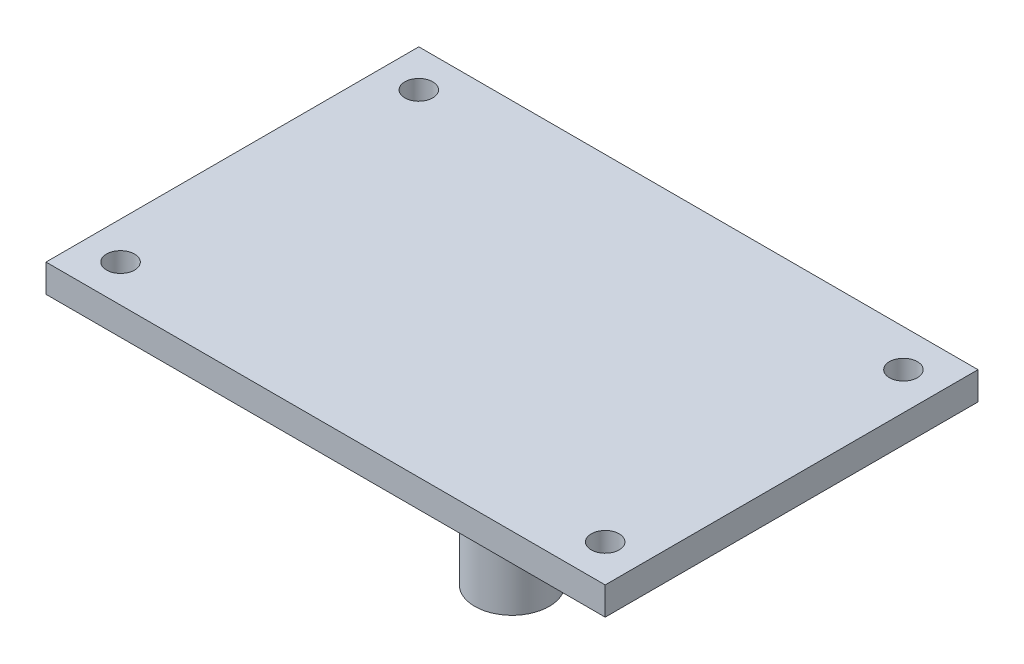
ISO-10303-21;
HEADER;
FILE_DESCRIPTION(('STEP AP214'),'2;1');
FILE_NAME('part.step','',(''),(''),'','','');
FILE_SCHEMA(('AUTOMOTIVE_DESIGN { 1 0 10303 214 1 1 1 1 }'));
ENDSEC;
DATA;
#1=APPLICATION_CONTEXT('core data for automotive mechanical design processes');
#2=APPLICATION_PROTOCOL_DEFINITION('international standard','automotive_design',2000,#1);
#3=PRODUCT_CONTEXT('',#1,'mechanical');
#4=PRODUCT('Part','Part','',(#3));
#5=PRODUCT_RELATED_PRODUCT_CATEGORY('part','',(#4));
#6=PRODUCT_DEFINITION_FORMATION('','',#4);
#7=PRODUCT_DEFINITION_CONTEXT('part definition',#1,'design');
#8=PRODUCT_DEFINITION('design','',#6,#7);
#9=PRODUCT_DEFINITION_SHAPE('','',#8);
#10=(LENGTH_UNIT() NAMED_UNIT(*) SI_UNIT(.MILLI.,.METRE.));
#11=(NAMED_UNIT(*) PLANE_ANGLE_UNIT() SI_UNIT($,.RADIAN.));
#12=(NAMED_UNIT(*) SI_UNIT($,.STERADIAN.) SOLID_ANGLE_UNIT());
#13=UNCERTAINTY_MEASURE_WITH_UNIT(LENGTH_MEASURE(1.E-05),#10,'distance_accuracy_value','');
#14=(GEOMETRIC_REPRESENTATION_CONTEXT(3) GLOBAL_UNCERTAINTY_ASSIGNED_CONTEXT((#13)) GLOBAL_UNIT_ASSIGNED_CONTEXT((#10,
#11,#12)) REPRESENTATION_CONTEXT('',''));
#15=CARTESIAN_POINT('',(0.,0.,0.));
#16=DIRECTION('',(0.,0.,1.));
#17=DIRECTION('',(1.,0.,0.));
#18=AXIS2_PLACEMENT_3D('',#15,#16,#17);
#19=CARTESIAN_POINT('',(0.,18.,0.));
#20=DIRECTION('',(0.,-1.,0.));
#21=DIRECTION('',(0.,0.,-1.));
#22=AXIS2_PLACEMENT_3D('',#19,#20,#21);
#23=CYLINDRICAL_SURFACE('',#22,4.);
#24=CARTESIAN_POINT('',(0.,18.,0.));
#25=DIRECTION('',(0.,1.,0.));
#26=DIRECTION('',(0.,0.,1.));
#27=AXIS2_PLACEMENT_3D('',#24,#25,#26);
#28=CIRCLE('',#27,4.);
#29=CARTESIAN_POINT('',(0.,18.,4.));
#30=VERTEX_POINT('',#29);
#31=EDGE_CURVE('E11',#30,#30,#28,.T.);
#32=ORIENTED_EDGE('',*,*,#31,.F.);
#33=EDGE_LOOP('',(#32));
#34=FACE_BOUND('',#33,.T.);
#35=CARTESIAN_POINT('',(0.,0.,0.));
#36=DIRECTION('',(0.,1.,0.));
#37=DIRECTION('',(0.,0.,1.));
#38=AXIS2_PLACEMENT_3D('',#35,#36,#37);
#39=CIRCLE('',#38,4.);
#40=CARTESIAN_POINT('',(0.,0.,4.));
#41=VERTEX_POINT('',#40);
#42=EDGE_CURVE('E41',#41,#41,#39,.T.);
#43=ORIENTED_EDGE('',*,*,#42,.T.);
#44=EDGE_LOOP('',(#43));
#45=FACE_BOUND('',#44,.T.);
#46=ADVANCED_FACE('F38',(#34,#45),#23,.T.);
#47=CARTESIAN_POINT('',(0.,0.,0.));
#48=DIRECTION('',(0.,1.,0.));
#49=DIRECTION('',(0.,0.,1.));
#50=AXIS2_PLACEMENT_3D('',#47,#48,#49);
#51=PLANE('',#50);
#52=ORIENTED_EDGE('',*,*,#42,.F.);
#53=EDGE_LOOP('',(#52));
#54=FACE_BOUND('',#53,.T.);
#55=ADVANCED_FACE('F150',(#54),#51,.F.);
#56=CARTESIAN_POINT('',(0.,22.,0.));
#57=DIRECTION('',(0.,-1.,0.));
#58=DIRECTION('',(0.,0.,-1.));
#59=AXIS2_PLACEMENT_3D('',#56,#57,#58);
#60=CYLINDRICAL_SURFACE('',#59,5.);
#61=CARTESIAN_POINT('',(0.,22.,0.));
#62=DIRECTION('',(0.,1.,0.));
#63=DIRECTION('',(0.,0.,1.));
#64=AXIS2_PLACEMENT_3D('',#61,#62,#63);
#65=CIRCLE('',#64,5.);
#66=CARTESIAN_POINT('',(0.,22.,5.));
#67=VERTEX_POINT('',#66);
#68=EDGE_CURVE('E129',#67,#67,#65,.T.);
#69=ORIENTED_EDGE('',*,*,#68,.F.);
#70=EDGE_LOOP('',(#69));
#71=FACE_BOUND('',#70,.T.);
#72=CARTESIAN_POINT('',(0.,18.,0.));
#73=DIRECTION('',(0.,1.,0.));
#74=DIRECTION('',(0.,0.,1.));
#75=AXIS2_PLACEMENT_3D('',#72,#73,#74);
#76=CIRCLE('',#75,5.);
#77=CARTESIAN_POINT('',(0.,18.,5.));
#78=VERTEX_POINT('',#77);
#79=EDGE_CURVE('E128',#78,#78,#76,.T.);
#80=ORIENTED_EDGE('',*,*,#79,.T.);
#81=EDGE_LOOP('',(#80));
#82=FACE_BOUND('',#81,.T.);
#83=ADVANCED_FACE('F137',(#71,#82),#60,.T.);
#84=CARTESIAN_POINT('',(0.,18.,0.));
#85=DIRECTION('',(0.,1.,0.));
#86=DIRECTION('',(0.,0.,1.));
#87=AXIS2_PLACEMENT_3D('',#84,#85,#86);
#88=PLANE('',#87);
#89=ORIENTED_EDGE('',*,*,#31,.T.);
#90=EDGE_LOOP('',(#89));
#91=FACE_BOUND('',#90,.T.);
#92=ORIENTED_EDGE('',*,*,#79,.F.);
#93=EDGE_LOOP('',(#92));
#94=FACE_BOUND('',#93,.T.);
#95=ADVANCED_FACE('F139',(#91,#94),#88,.F.);
#96=CARTESIAN_POINT('',(0.,25.,0.));
#97=DIRECTION('',(0.,1.,0.));
#98=DIRECTION('',(0.,0.,1.));
#99=AXIS2_PLACEMENT_3D('',#96,#97,#98);
#100=PLANE('',#99);
#101=CARTESIAN_POINT('',(26.,25.,16.));
#102=DIRECTION('',(0.,1.,0.));
#103=DIRECTION('',(0.,0.,1.));
#104=AXIS2_PLACEMENT_3D('',#101,#102,#103);
#105=CIRCLE('',#104,1.5);
#106=CARTESIAN_POINT('',(26.,25.,17.5));
#107=VERTEX_POINT('',#106);
#108=EDGE_CURVE('E282',#107,#107,#105,.T.);
#109=ORIENTED_EDGE('',*,*,#108,.F.);
#110=EDGE_LOOP('',(#109));
#111=FACE_BOUND('',#110,.T.);
#112=CARTESIAN_POINT('',(-26.,25.,-16.));
#113=DIRECTION('',(0.,1.,0.));
#114=DIRECTION('',(0.,0.,1.));
#115=AXIS2_PLACEMENT_3D('',#112,#113,#114);
#116=CIRCLE('',#115,1.5);
#117=CARTESIAN_POINT('',(-26.,25.,-14.5));
#118=VERTEX_POINT('',#117);
#119=EDGE_CURVE('E115',#118,#118,#116,.T.);
#120=ORIENTED_EDGE('',*,*,#119,.F.);
#121=EDGE_LOOP('',(#120));
#122=FACE_BOUND('',#121,.T.);
#123=DIRECTION('',(0.,0.,-1.));
#124=VECTOR('',#123,1.);
#125=CARTESIAN_POINT('',(30.,25.,-20.));
#126=LINE('',#125,#124);
#127=CARTESIAN_POINT('',(30.,25.,20.));
#128=VERTEX_POINT('',#127);
#129=CARTESIAN_POINT('',(30.,25.,-20.));
#130=VERTEX_POINT('',#129);
#131=EDGE_CURVE('E92',#128,#130,#126,.T.);
#132=ORIENTED_EDGE('',*,*,#131,.T.);
#133=DIRECTION('',(-1.,0.,0.));
#134=VECTOR('',#133,1.);
#135=CARTESIAN_POINT('',(-30.,25.,-20.));
#136=LINE('',#135,#134);
#137=CARTESIAN_POINT('',(-30.,25.,-20.));
#138=VERTEX_POINT('',#137);
#139=EDGE_CURVE('E86',#130,#138,#136,.T.);
#140=ORIENTED_EDGE('',*,*,#139,.T.);
#141=DIRECTION('',(0.,0.,1.));
#142=VECTOR('',#141,1.);
#143=CARTESIAN_POINT('',(-30.,25.,-20.));
#144=LINE('',#143,#142);
#145=CARTESIAN_POINT('',(-30.,25.,20.));
#146=VERTEX_POINT('',#145);
#147=EDGE_CURVE('E90',#138,#146,#144,.T.);
#148=ORIENTED_EDGE('',*,*,#147,.T.);
#149=DIRECTION('',(1.,0.,0.));
#150=VECTOR('',#149,1.);
#151=CARTESIAN_POINT('',(-30.,25.,20.));
#152=LINE('',#151,#150);
#153=EDGE_CURVE('E55',#146,#128,#152,.T.);
#154=ORIENTED_EDGE('',*,*,#153,.T.);
#155=EDGE_LOOP('',(#132,#140,#148,#154));
#156=FACE_BOUND('',#155,.T.);
#157=CARTESIAN_POINT('',(26.,25.,-16.));
#158=DIRECTION('',(0.,1.,0.));
#159=DIRECTION('',(0.,0.,-1.));
#160=AXIS2_PLACEMENT_3D('',#157,#158,#159);
#161=CIRCLE('',#160,1.5);
#162=CARTESIAN_POINT('',(26.,25.,-17.5));
#163=VERTEX_POINT('',#162);
#164=EDGE_CURVE('E290',#163,#163,#161,.T.);
#165=ORIENTED_EDGE('',*,*,#164,.F.);
#166=EDGE_LOOP('',(#165));
#167=FACE_BOUND('',#166,.T.);
#168=CARTESIAN_POINT('',(-26.,25.,16.));
#169=DIRECTION('',(0.,1.,0.));
#170=DIRECTION('',(0.,0.,-1.));
#171=AXIS2_PLACEMENT_3D('',#168,#169,#170);
#172=CIRCLE('',#171,1.5);
#173=CARTESIAN_POINT('',(-26.,25.,14.5));
#174=VERTEX_POINT('',#173);
#175=EDGE_CURVE('E271',#174,#174,#172,.T.);
#176=ORIENTED_EDGE('',*,*,#175,.F.);
#177=EDGE_LOOP('',(#176));
#178=FACE_BOUND('',#177,.T.);
#179=ADVANCED_FACE('F87',(#111,#122,#156,#167,#178),#100,.T.);
#180=CARTESIAN_POINT('',(0.,22.,0.));
#181=DIRECTION('',(0.,1.,0.));
#182=DIRECTION('',(0.,0.,1.));
#183=AXIS2_PLACEMENT_3D('',#180,#181,#182);
#184=PLANE('',#183);
#185=ORIENTED_EDGE('',*,*,#68,.T.);
#186=EDGE_LOOP('',(#185));
#187=FACE_BOUND('',#186,.T.);
#188=DIRECTION('',(0.,0.,-1.));
#189=VECTOR('',#188,1.);
#190=CARTESIAN_POINT('',(30.,22.,-20.));
#191=LINE('',#190,#189);
#192=CARTESIAN_POINT('',(30.,22.,20.));
#193=VERTEX_POINT('',#192);
#194=CARTESIAN_POINT('',(30.,22.,-20.));
#195=VERTEX_POINT('',#194);
#196=EDGE_CURVE('E111',#193,#195,#191,.T.);
#197=ORIENTED_EDGE('',*,*,#196,.F.);
#198=DIRECTION('',(1.,0.,0.));
#199=VECTOR('',#198,1.);
#200=CARTESIAN_POINT('',(-30.,22.,20.));
#201=LINE('',#200,#199);
#202=CARTESIAN_POINT('',(-30.,22.,20.));
#203=VERTEX_POINT('',#202);
#204=EDGE_CURVE('E78',#203,#193,#201,.T.);
#205=ORIENTED_EDGE('',*,*,#204,.F.);
#206=DIRECTION('',(0.,0.,1.));
#207=VECTOR('',#206,1.);
#208=CARTESIAN_POINT('',(-30.,22.,-20.));
#209=LINE('',#208,#207);
#210=CARTESIAN_POINT('',(-30.,22.,-20.));
#211=VERTEX_POINT('',#210);
#212=EDGE_CURVE('E72',#211,#203,#209,.T.);
#213=ORIENTED_EDGE('',*,*,#212,.F.);
#214=DIRECTION('',(-1.,0.,0.));
#215=VECTOR('',#214,1.);
#216=CARTESIAN_POINT('',(-30.,22.,-20.));
#217=LINE('',#216,#215);
#218=EDGE_CURVE('E98',#195,#211,#217,.T.);
#219=ORIENTED_EDGE('',*,*,#218,.F.);
#220=EDGE_LOOP('',(#197,#205,#213,#219));
#221=FACE_BOUND('',#220,.T.);
#222=CARTESIAN_POINT('',(-26.,22.,-16.));
#223=DIRECTION('',(0.,1.,0.));
#224=DIRECTION('',(0.,0.,1.));
#225=AXIS2_PLACEMENT_3D('',#222,#223,#224);
#226=CIRCLE('',#225,1.5);
#227=CARTESIAN_POINT('',(-26.,22.,-14.5));
#228=VERTEX_POINT('',#227);
#229=EDGE_CURVE('E294',#228,#228,#226,.T.);
#230=ORIENTED_EDGE('',*,*,#229,.T.);
#231=EDGE_LOOP('',(#230));
#232=FACE_BOUND('',#231,.T.);
#233=CARTESIAN_POINT('',(26.,22.,-16.));
#234=DIRECTION('',(0.,1.,0.));
#235=DIRECTION('',(0.,0.,-1.));
#236=AXIS2_PLACEMENT_3D('',#233,#234,#235);
#237=CIRCLE('',#236,1.5);
#238=CARTESIAN_POINT('',(26.,22.,-17.5));
#239=VERTEX_POINT('',#238);
#240=EDGE_CURVE('E286',#239,#239,#237,.T.);
#241=ORIENTED_EDGE('',*,*,#240,.T.);
#242=EDGE_LOOP('',(#241));
#243=FACE_BOUND('',#242,.T.);
#244=CARTESIAN_POINT('',(26.,22.,16.));
#245=DIRECTION('',(0.,1.,0.));
#246=DIRECTION('',(0.,0.,1.));
#247=AXIS2_PLACEMENT_3D('',#244,#245,#246);
#248=CIRCLE('',#247,1.5);
#249=CARTESIAN_POINT('',(26.,22.,17.5));
#250=VERTEX_POINT('',#249);
#251=EDGE_CURVE('E279',#250,#250,#248,.T.);
#252=ORIENTED_EDGE('',*,*,#251,.T.);
#253=EDGE_LOOP('',(#252));
#254=FACE_BOUND('',#253,.T.);
#255=CARTESIAN_POINT('',(-26.,22.,16.));
#256=DIRECTION('',(0.,1.,0.));
#257=DIRECTION('',(0.,0.,-1.));
#258=AXIS2_PLACEMENT_3D('',#255,#256,#257);
#259=CIRCLE('',#258,1.5);
#260=CARTESIAN_POINT('',(-26.,22.,14.5));
#261=VERTEX_POINT('',#260);
#262=EDGE_CURVE('E274',#261,#261,#259,.T.);
#263=ORIENTED_EDGE('',*,*,#262,.T.);
#264=EDGE_LOOP('',(#263));
#265=FACE_BOUND('',#264,.T.);
#266=ADVANCED_FACE('F147',(#187,#221,#232,#243,#254,#265),#184,.F.);
#267=CARTESIAN_POINT('',(30.,25.,-20.));
#268=DIRECTION('',(-1.,0.,0.));
#269=DIRECTION('',(0.,0.,1.));
#270=AXIS2_PLACEMENT_3D('',#267,#268,#269);
#271=PLANE('',#270);
#272=ORIENTED_EDGE('',*,*,#196,.T.);
#273=DIRECTION('',(0.,-1.,0.));
#274=VECTOR('',#273,1.);
#275=CARTESIAN_POINT('',(30.,25.,-20.));
#276=LINE('',#275,#274);
#277=EDGE_CURVE('E100',#130,#195,#276,.T.);
#278=ORIENTED_EDGE('',*,*,#277,.F.);
#279=ORIENTED_EDGE('',*,*,#131,.F.);
#280=DIRECTION('',(0.,-1.,0.));
#281=VECTOR('',#280,1.);
#282=CARTESIAN_POINT('',(30.,25.,20.));
#283=LINE('',#282,#281);
#284=EDGE_CURVE('E107',#128,#193,#283,.T.);
#285=ORIENTED_EDGE('',*,*,#284,.T.);
#286=EDGE_LOOP('',(#272,#278,#279,#285));
#287=FACE_BOUND('',#286,.T.);
#288=ADVANCED_FACE('F190',(#287),#271,.F.);
#289=CARTESIAN_POINT('',(-30.,25.,-20.));
#290=DIRECTION('',(0.,0.,1.));
#291=DIRECTION('',(1.,0.,0.));
#292=AXIS2_PLACEMENT_3D('',#289,#290,#291);
#293=PLANE('',#292);
#294=ORIENTED_EDGE('',*,*,#218,.T.);
#295=DIRECTION('',(0.,-1.,0.));
#296=VECTOR('',#295,1.);
#297=CARTESIAN_POINT('',(-30.,25.,-20.));
#298=LINE('',#297,#296);
#299=EDGE_CURVE('E96',#138,#211,#298,.T.);
#300=ORIENTED_EDGE('',*,*,#299,.F.);
#301=ORIENTED_EDGE('',*,*,#139,.F.);
#302=ORIENTED_EDGE('',*,*,#277,.T.);
#303=EDGE_LOOP('',(#294,#300,#301,#302));
#304=FACE_BOUND('',#303,.T.);
#305=ADVANCED_FACE('F97',(#304),#293,.F.);
#306=CARTESIAN_POINT('',(-30.,25.,-20.));
#307=DIRECTION('',(1.,0.,0.));
#308=DIRECTION('',(0.,0.,-1.));
#309=AXIS2_PLACEMENT_3D('',#306,#307,#308);
#310=PLANE('',#309);
#311=ORIENTED_EDGE('',*,*,#212,.T.);
#312=DIRECTION('',(0.,-1.,0.));
#313=VECTOR('',#312,1.);
#314=CARTESIAN_POINT('',(-30.,25.,20.));
#315=LINE('',#314,#313);
#316=EDGE_CURVE('E101',#146,#203,#315,.T.);
#317=ORIENTED_EDGE('',*,*,#316,.F.);
#318=ORIENTED_EDGE('',*,*,#147,.F.);
#319=ORIENTED_EDGE('',*,*,#299,.T.);
#320=EDGE_LOOP('',(#311,#317,#318,#319));
#321=FACE_BOUND('',#320,.T.);
#322=ADVANCED_FACE('F103',(#321),#310,.F.);
#323=CARTESIAN_POINT('',(-30.,25.,20.));
#324=DIRECTION('',(0.,0.,-1.));
#325=DIRECTION('',(-1.,0.,0.));
#326=AXIS2_PLACEMENT_3D('',#323,#324,#325);
#327=PLANE('',#326);
#328=ORIENTED_EDGE('',*,*,#204,.T.);
#329=ORIENTED_EDGE('',*,*,#284,.F.);
#330=ORIENTED_EDGE('',*,*,#153,.F.);
#331=ORIENTED_EDGE('',*,*,#316,.T.);
#332=EDGE_LOOP('',(#328,#329,#330,#331));
#333=FACE_BOUND('',#332,.T.);
#334=ADVANCED_FACE('F216',(#333),#327,.F.);
#335=CARTESIAN_POINT('',(-26.,25.,-16.));
#336=DIRECTION('',(0.,-1.,0.));
#337=DIRECTION('',(0.,0.,-1.));
#338=AXIS2_PLACEMENT_3D('',#335,#336,#337);
#339=CYLINDRICAL_SURFACE('',#338,1.5);
#340=ORIENTED_EDGE('',*,*,#119,.T.);
#341=EDGE_LOOP('',(#340));
#342=FACE_BOUND('',#341,.T.);
#343=ORIENTED_EDGE('',*,*,#229,.F.);
#344=EDGE_LOOP('',(#343));
#345=FACE_BOUND('',#344,.T.);
#346=ADVANCED_FACE('F225',(#342,#345),#339,.F.);
#347=CARTESIAN_POINT('',(26.,25.,-16.));
#348=DIRECTION('',(0.,-1.,0.));
#349=DIRECTION('',(0.,0.,-1.));
#350=AXIS2_PLACEMENT_3D('',#347,#348,#349);
#351=CYLINDRICAL_SURFACE('',#350,1.5);
#352=ORIENTED_EDGE('',*,*,#164,.T.);
#353=EDGE_LOOP('',(#352));
#354=FACE_BOUND('',#353,.T.);
#355=ORIENTED_EDGE('',*,*,#240,.F.);
#356=EDGE_LOOP('',(#355));
#357=FACE_BOUND('',#356,.T.);
#358=ADVANCED_FACE('F234',(#354,#357),#351,.F.);
#359=CARTESIAN_POINT('',(26.,25.,16.));
#360=DIRECTION('',(0.,-1.,0.));
#361=DIRECTION('',(0.,0.,-1.));
#362=AXIS2_PLACEMENT_3D('',#359,#360,#361);
#363=CYLINDRICAL_SURFACE('',#362,1.5);
#364=ORIENTED_EDGE('',*,*,#108,.T.);
#365=EDGE_LOOP('',(#364));
#366=FACE_BOUND('',#365,.T.);
#367=ORIENTED_EDGE('',*,*,#251,.F.);
#368=EDGE_LOOP('',(#367));
#369=FACE_BOUND('',#368,.T.);
#370=ADVANCED_FACE('F244',(#366,#369),#363,.F.);
#371=CARTESIAN_POINT('',(-26.,25.,16.));
#372=DIRECTION('',(0.,-1.,0.));
#373=DIRECTION('',(0.,0.,-1.));
#374=AXIS2_PLACEMENT_3D('',#371,#372,#373);
#375=CYLINDRICAL_SURFACE('',#374,1.5);
#376=ORIENTED_EDGE('',*,*,#175,.T.);
#377=EDGE_LOOP('',(#376));
#378=FACE_BOUND('',#377,.T.);
#379=ORIENTED_EDGE('',*,*,#262,.F.);
#380=EDGE_LOOP('',(#379));
#381=FACE_BOUND('',#380,.T.);
#382=ADVANCED_FACE('F254',(#378,#381),#375,.F.);
#383=CLOSED_SHELL('',(#46,#55,#83,#95,#179,#266,#288,#305,#322,#334,#346,#358,#370,#382));
#384=MANIFOLD_SOLID_BREP('B2',#383);
#385=ADVANCED_BREP_SHAPE_REPRESENTATION('',(#18,#384),#14);
#386=SHAPE_DEFINITION_REPRESENTATION(#9,#385);
ENDSEC;
END-ISO-10303-21;
